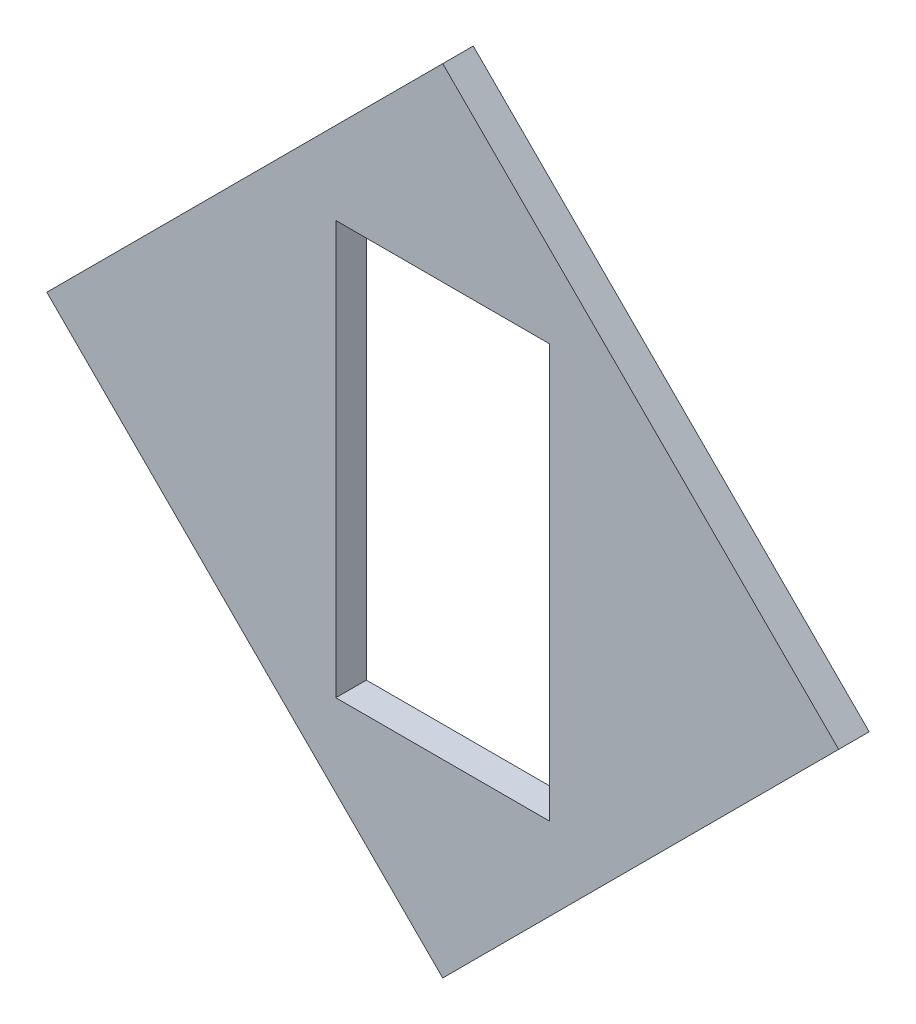
ISO-10303-21;
HEADER;
FILE_DESCRIPTION(('STEP AP214'),'2;1');
FILE_NAME('part.step','',(''),(''),'','','');
FILE_SCHEMA(('AUTOMOTIVE_DESIGN { 1 0 10303 214 1 1 1 1 }'));
ENDSEC;
DATA;
#1=APPLICATION_CONTEXT('core data for automotive mechanical design processes');
#2=APPLICATION_PROTOCOL_DEFINITION('international standard','automotive_design',2000,#1);
#3=PRODUCT_CONTEXT('',#1,'mechanical');
#4=PRODUCT('Part','Part','',(#3));
#5=PRODUCT_RELATED_PRODUCT_CATEGORY('part','',(#4));
#6=PRODUCT_DEFINITION_FORMATION('','',#4);
#7=PRODUCT_DEFINITION_CONTEXT('part definition',#1,'design');
#8=PRODUCT_DEFINITION('design','',#6,#7);
#9=PRODUCT_DEFINITION_SHAPE('','',#8);
#10=(LENGTH_UNIT() NAMED_UNIT(*) SI_UNIT(.MILLI.,.METRE.));
#11=(NAMED_UNIT(*) PLANE_ANGLE_UNIT() SI_UNIT($,.RADIAN.));
#12=(NAMED_UNIT(*) SI_UNIT($,.STERADIAN.) SOLID_ANGLE_UNIT());
#13=UNCERTAINTY_MEASURE_WITH_UNIT(LENGTH_MEASURE(1.E-05),#10,'distance_accuracy_value','');
#14=(GEOMETRIC_REPRESENTATION_CONTEXT(3) GLOBAL_UNCERTAINTY_ASSIGNED_CONTEXT((#13)) GLOBAL_UNIT_ASSIGNED_CONTEXT((#10,
#11,#12)) REPRESENTATION_CONTEXT('',''));
#15=CARTESIAN_POINT('',(0.,0.,0.));
#16=DIRECTION('',(0.,0.,1.));
#17=DIRECTION('',(1.,0.,0.));
#18=AXIS2_PLACEMENT_3D('',#15,#16,#17);
#19=CARTESIAN_POINT('',(0.,38.8908729652601,3.));
#20=DIRECTION('',(-0.707106781186548,-0.707106781186547,0.));
#21=DIRECTION('',(0.707106781186547,-0.707106781186548,0.));
#22=AXIS2_PLACEMENT_3D('',#19,#20,#21);
#23=PLANE('',#22);
#24=DIRECTION('',(-0.707106781186547,0.707106781186548,0.));
#25=VECTOR('',#24,1.);
#26=CARTESIAN_POINT('',(0.,38.8908729652601,0.));
#27=LINE('',#26,#25);
#28=CARTESIAN_POINT('',(38.8908729652601,0.,0.));
#29=VERTEX_POINT('',#28);
#30=CARTESIAN_POINT('',(0.,38.8908729652601,0.));
#31=VERTEX_POINT('',#30);
#32=EDGE_CURVE('E130',#29,#31,#27,.T.);
#33=ORIENTED_EDGE('',*,*,#32,.T.);
#34=DIRECTION('',(0.,0.,-1.));
#35=VECTOR('',#34,1.);
#36=CARTESIAN_POINT('',(0.,38.8908729652601,3.));
#37=LINE('',#36,#35);
#38=CARTESIAN_POINT('',(0.,38.8908729652601,3.));
#39=VERTEX_POINT('',#38);
#40=EDGE_CURVE('E11',#39,#31,#37,.T.);
#41=ORIENTED_EDGE('',*,*,#40,.F.);
#42=DIRECTION('',(-0.707106781186547,0.707106781186548,0.));
#43=VECTOR('',#42,1.);
#44=CARTESIAN_POINT('',(0.,38.8908729652601,3.));
#45=LINE('',#44,#43);
#46=CARTESIAN_POINT('',(38.8908729652601,0.,3.));
#47=VERTEX_POINT('',#46);
#48=EDGE_CURVE('E134',#47,#39,#45,.T.);
#49=ORIENTED_EDGE('',*,*,#48,.F.);
#50=DIRECTION('',(0.,0.,-1.));
#51=VECTOR('',#50,1.);
#52=CARTESIAN_POINT('',(38.8908729652601,0.,3.));
#53=LINE('',#52,#51);
#54=EDGE_CURVE('E144',#47,#29,#53,.T.);
#55=ORIENTED_EDGE('',*,*,#54,.T.);
#56=EDGE_LOOP('',(#33,#41,#49,#55));
#57=FACE_BOUND('',#56,.T.);
#58=ADVANCED_FACE('F33',(#57),#23,.F.);
#59=CARTESIAN_POINT('',(-38.8908729652601,0.,3.));
#60=DIRECTION('',(0.707106781186548,-0.707106781186548,0.));
#61=DIRECTION('',(0.707106781186548,0.707106781186548,0.));
#62=AXIS2_PLACEMENT_3D('',#59,#60,#61);
#63=PLANE('',#62);
#64=DIRECTION('',(-0.707106781186547,-0.707106781186547,0.));
#65=VECTOR('',#64,1.);
#66=CARTESIAN_POINT('',(-38.8908729652601,0.,0.));
#67=LINE('',#66,#65);
#68=CARTESIAN_POINT('',(-38.8908729652601,0.,0.));
#69=VERTEX_POINT('',#68);
#70=EDGE_CURVE('E147',#31,#69,#67,.T.);
#71=ORIENTED_EDGE('',*,*,#70,.T.);
#72=DIRECTION('',(0.,0.,-1.));
#73=VECTOR('',#72,1.);
#74=CARTESIAN_POINT('',(-38.8908729652601,0.,3.));
#75=LINE('',#74,#73);
#76=CARTESIAN_POINT('',(-38.8908729652601,0.,3.));
#77=VERTEX_POINT('',#76);
#78=EDGE_CURVE('E40',#77,#69,#75,.T.);
#79=ORIENTED_EDGE('',*,*,#78,.F.);
#80=DIRECTION('',(-0.707106781186547,-0.707106781186547,0.));
#81=VECTOR('',#80,1.);
#82=CARTESIAN_POINT('',(-38.8908729652601,0.,3.));
#83=LINE('',#82,#81);
#84=EDGE_CURVE('E137',#39,#77,#83,.T.);
#85=ORIENTED_EDGE('',*,*,#84,.F.);
#86=ORIENTED_EDGE('',*,*,#40,.T.);
#87=EDGE_LOOP('',(#71,#79,#85,#86));
#88=FACE_BOUND('',#87,.T.);
#89=ADVANCED_FACE('F175',(#88),#63,.F.);
#90=CARTESIAN_POINT('',(-38.8908729652601,0.,3.));
#91=DIRECTION('',(0.707106781186548,0.707106781186547,0.));
#92=DIRECTION('',(-0.707106781186547,0.707106781186548,0.));
#93=AXIS2_PLACEMENT_3D('',#90,#91,#92);
#94=PLANE('',#93);
#95=DIRECTION('',(0.707106781186547,-0.707106781186548,0.));
#96=VECTOR('',#95,1.);
#97=CARTESIAN_POINT('',(-38.8908729652601,0.,0.));
#98=LINE('',#97,#96);
#99=CARTESIAN_POINT('',(0.,-38.8908729652601,0.));
#100=VERTEX_POINT('',#99);
#101=EDGE_CURVE('E149',#69,#100,#98,.T.);
#102=ORIENTED_EDGE('',*,*,#101,.T.);
#103=DIRECTION('',(0.,0.,-1.));
#104=VECTOR('',#103,1.);
#105=CARTESIAN_POINT('',(0.,-38.8908729652601,3.));
#106=LINE('',#105,#104);
#107=CARTESIAN_POINT('',(0.,-38.8908729652601,3.));
#108=VERTEX_POINT('',#107);
#109=EDGE_CURVE('E154',#108,#100,#106,.T.);
#110=ORIENTED_EDGE('',*,*,#109,.F.);
#111=DIRECTION('',(0.707106781186547,-0.707106781186548,0.));
#112=VECTOR('',#111,1.);
#113=CARTESIAN_POINT('',(-38.8908729652601,0.,3.));
#114=LINE('',#113,#112);
#115=EDGE_CURVE('E140',#77,#108,#114,.T.);
#116=ORIENTED_EDGE('',*,*,#115,.F.);
#117=ORIENTED_EDGE('',*,*,#78,.T.);
#118=EDGE_LOOP('',(#102,#110,#116,#117));
#119=FACE_BOUND('',#118,.T.);
#120=ADVANCED_FACE('F161',(#119),#94,.F.);
#121=CARTESIAN_POINT('',(0.,-38.8908729652601,3.));
#122=DIRECTION('',(-0.707106781186547,0.707106781186548,0.));
#123=DIRECTION('',(-0.707106781186548,-0.707106781186547,0.));
#124=AXIS2_PLACEMENT_3D('',#121,#122,#123);
#125=PLANE('',#124);
#126=DIRECTION('',(0.707106781186548,0.707106781186547,0.));
#127=VECTOR('',#126,1.);
#128=CARTESIAN_POINT('',(0.,-38.8908729652601,0.));
#129=LINE('',#128,#127);
#130=EDGE_CURVE('E138',#100,#29,#129,.T.);
#131=ORIENTED_EDGE('',*,*,#130,.T.);
#132=ORIENTED_EDGE('',*,*,#54,.F.);
#133=DIRECTION('',(0.707106781186548,0.707106781186547,0.));
#134=VECTOR('',#133,1.);
#135=CARTESIAN_POINT('',(0.,-38.8908729652601,3.));
#136=LINE('',#135,#134);
#137=EDGE_CURVE('E142',#108,#47,#136,.T.);
#138=ORIENTED_EDGE('',*,*,#137,.F.);
#139=ORIENTED_EDGE('',*,*,#109,.T.);
#140=EDGE_LOOP('',(#131,#132,#138,#139));
#141=FACE_BOUND('',#140,.T.);
#142=ADVANCED_FACE('F168',(#141),#125,.F.);
#143=CARTESIAN_POINT('',(0.,0.,3.));
#144=DIRECTION('',(0.,0.,1.));
#145=DIRECTION('',(1.,0.,0.));
#146=AXIS2_PLACEMENT_3D('',#143,#144,#145);
#147=PLANE('',#146);
#148=DIRECTION('',(0.,-1.,0.));
#149=VECTOR('',#148,1.);
#150=CARTESIAN_POINT('',(-10.5,-20.3,3.));
#151=LINE('',#150,#149);
#152=CARTESIAN_POINT('',(-10.5,20.3,3.));
#153=VERTEX_POINT('',#152);
#154=CARTESIAN_POINT('',(-10.5,-20.3,3.));
#155=VERTEX_POINT('',#154);
#156=EDGE_CURVE('E47',#153,#155,#151,.T.);
#157=ORIENTED_EDGE('',*,*,#156,.F.);
#158=DIRECTION('',(-1.,0.,0.));
#159=VECTOR('',#158,1.);
#160=CARTESIAN_POINT('',(10.5,20.3,3.));
#161=LINE('',#160,#159);
#162=CARTESIAN_POINT('',(10.5,20.3,3.));
#163=VERTEX_POINT('',#162);
#164=EDGE_CURVE('E115',#163,#153,#161,.T.);
#165=ORIENTED_EDGE('',*,*,#164,.F.);
#166=DIRECTION('',(0.,1.,0.));
#167=VECTOR('',#166,1.);
#168=CARTESIAN_POINT('',(10.5,-20.3,3.));
#169=LINE('',#168,#167);
#170=CARTESIAN_POINT('',(10.5,-20.3,3.));
#171=VERTEX_POINT('',#170);
#172=EDGE_CURVE('E118',#171,#163,#169,.T.);
#173=ORIENTED_EDGE('',*,*,#172,.F.);
#174=DIRECTION('',(1.,0.,0.));
#175=VECTOR('',#174,1.);
#176=CARTESIAN_POINT('',(10.5,-20.3,3.));
#177=LINE('',#176,#175);
#178=EDGE_CURVE('E124',#155,#171,#177,.T.);
#179=ORIENTED_EDGE('',*,*,#178,.F.);
#180=EDGE_LOOP('',(#157,#165,#173,#179));
#181=FACE_BOUND('',#180,.T.);
#182=ORIENTED_EDGE('',*,*,#48,.T.);
#183=ORIENTED_EDGE('',*,*,#84,.T.);
#184=ORIENTED_EDGE('',*,*,#115,.T.);
#185=ORIENTED_EDGE('',*,*,#137,.T.);
#186=EDGE_LOOP('',(#182,#183,#184,#185));
#187=FACE_BOUND('',#186,.T.);
#188=ADVANCED_FACE('F174',(#181,#187),#147,.T.);
#189=CARTESIAN_POINT('',(0.,0.,0.));
#190=DIRECTION('',(0.,0.,1.));
#191=DIRECTION('',(1.,0.,0.));
#192=AXIS2_PLACEMENT_3D('',#189,#190,#191);
#193=PLANE('',#192);
#194=DIRECTION('',(-1.,0.,0.));
#195=VECTOR('',#194,1.);
#196=CARTESIAN_POINT('',(10.5,20.3,0.));
#197=LINE('',#196,#195);
#198=CARTESIAN_POINT('',(10.5,20.3,0.));
#199=VERTEX_POINT('',#198);
#200=CARTESIAN_POINT('',(-10.5,20.3,0.));
#201=VERTEX_POINT('',#200);
#202=EDGE_CURVE('E105',#199,#201,#197,.T.);
#203=ORIENTED_EDGE('',*,*,#202,.T.);
#204=DIRECTION('',(0.,-1.,0.));
#205=VECTOR('',#204,1.);
#206=CARTESIAN_POINT('',(-10.5,-20.3,0.));
#207=LINE('',#206,#205);
#208=CARTESIAN_POINT('',(-10.5,-20.3,0.));
#209=VERTEX_POINT('',#208);
#210=EDGE_CURVE('E99',#201,#209,#207,.T.);
#211=ORIENTED_EDGE('',*,*,#210,.T.);
#212=DIRECTION('',(1.,0.,0.));
#213=VECTOR('',#212,1.);
#214=CARTESIAN_POINT('',(10.5,-20.3,0.));
#215=LINE('',#214,#213);
#216=CARTESIAN_POINT('',(10.5,-20.3,0.));
#217=VERTEX_POINT('',#216);
#218=EDGE_CURVE('E108',#209,#217,#215,.T.);
#219=ORIENTED_EDGE('',*,*,#218,.T.);
#220=DIRECTION('',(0.,1.,0.));
#221=VECTOR('',#220,1.);
#222=CARTESIAN_POINT('',(10.5,-20.3,0.));
#223=LINE('',#222,#221);
#224=EDGE_CURVE('E55',#217,#199,#223,.T.);
#225=ORIENTED_EDGE('',*,*,#224,.T.);
#226=EDGE_LOOP('',(#203,#211,#219,#225));
#227=FACE_BOUND('',#226,.T.);
#228=ORIENTED_EDGE('',*,*,#32,.F.);
#229=ORIENTED_EDGE('',*,*,#130,.F.);
#230=ORIENTED_EDGE('',*,*,#101,.F.);
#231=ORIENTED_EDGE('',*,*,#70,.F.);
#232=EDGE_LOOP('',(#228,#229,#230,#231));
#233=FACE_BOUND('',#232,.T.);
#234=ADVANCED_FACE('F112',(#227,#233),#193,.F.);
#235=CARTESIAN_POINT('',(-10.5,-20.3,0.));
#236=DIRECTION('',(-1.,0.,0.));
#237=DIRECTION('',(0.,0.,1.));
#238=AXIS2_PLACEMENT_3D('',#235,#236,#237);
#239=PLANE('',#238);
#240=ORIENTED_EDGE('',*,*,#156,.T.);
#241=DIRECTION('',(0.,0.,1.));
#242=VECTOR('',#241,1.);
#243=CARTESIAN_POINT('',(-10.5,-20.3,0.));
#244=LINE('',#243,#242);
#245=EDGE_CURVE('E95',#209,#155,#244,.T.);
#246=ORIENTED_EDGE('',*,*,#245,.F.);
#247=ORIENTED_EDGE('',*,*,#210,.F.);
#248=DIRECTION('',(0.,0.,1.));
#249=VECTOR('',#248,1.);
#250=CARTESIAN_POINT('',(-10.5,20.3,0.));
#251=LINE('',#250,#249);
#252=EDGE_CURVE('E128',#201,#153,#251,.T.);
#253=ORIENTED_EDGE('',*,*,#252,.T.);
#254=EDGE_LOOP('',(#240,#246,#247,#253));
#255=FACE_BOUND('',#254,.T.);
#256=ADVANCED_FACE('F97',(#255),#239,.F.);
#257=CARTESIAN_POINT('',(10.5,20.3,0.));
#258=DIRECTION('',(0.,1.,0.));
#259=DIRECTION('',(0.,0.,1.));
#260=AXIS2_PLACEMENT_3D('',#257,#258,#259);
#261=PLANE('',#260);
#262=ORIENTED_EDGE('',*,*,#164,.T.);
#263=ORIENTED_EDGE('',*,*,#252,.F.);
#264=ORIENTED_EDGE('',*,*,#202,.F.);
#265=DIRECTION('',(0.,0.,1.));
#266=VECTOR('',#265,1.);
#267=CARTESIAN_POINT('',(10.5,20.3,0.));
#268=LINE('',#267,#266);
#269=EDGE_CURVE('E131',#199,#163,#268,.T.);
#270=ORIENTED_EDGE('',*,*,#269,.T.);
#271=EDGE_LOOP('',(#262,#263,#264,#270));
#272=FACE_BOUND('',#271,.T.);
#273=ADVANCED_FACE('F192',(#272),#261,.F.);
#274=CARTESIAN_POINT('',(10.5,-20.3,0.));
#275=DIRECTION('',(1.,0.,0.));
#276=DIRECTION('',(0.,0.,-1.));
#277=AXIS2_PLACEMENT_3D('',#274,#275,#276);
#278=PLANE('',#277);
#279=ORIENTED_EDGE('',*,*,#172,.T.);
#280=ORIENTED_EDGE('',*,*,#269,.F.);
#281=ORIENTED_EDGE('',*,*,#224,.F.);
#282=DIRECTION('',(0.,0.,1.));
#283=VECTOR('',#282,1.);
#284=CARTESIAN_POINT('',(10.5,-20.3,0.));
#285=LINE('',#284,#283);
#286=EDGE_CURVE('E104',#217,#171,#285,.T.);
#287=ORIENTED_EDGE('',*,*,#286,.T.);
#288=EDGE_LOOP('',(#279,#280,#281,#287));
#289=FACE_BOUND('',#288,.T.);
#290=ADVANCED_FACE('F195',(#289),#278,.F.);
#291=CARTESIAN_POINT('',(10.5,-20.3,0.));
#292=DIRECTION('',(0.,-1.,0.));
#293=DIRECTION('',(1.,0.,0.));
#294=AXIS2_PLACEMENT_3D('',#291,#292,#293);
#295=PLANE('',#294);
#296=ORIENTED_EDGE('',*,*,#178,.T.);
#297=ORIENTED_EDGE('',*,*,#286,.F.);
#298=ORIENTED_EDGE('',*,*,#218,.F.);
#299=ORIENTED_EDGE('',*,*,#245,.T.);
#300=EDGE_LOOP('',(#296,#297,#298,#299));
#301=FACE_BOUND('',#300,.T.);
#302=ADVANCED_FACE('F109',(#301),#295,.F.);
#303=CLOSED_SHELL('',(#58,#89,#120,#142,#188,#234,#256,#273,#290,#302));
#304=MANIFOLD_SOLID_BREP('B2',#303);
#305=ADVANCED_BREP_SHAPE_REPRESENTATION('',(#18,#304),#14);
#306=SHAPE_DEFINITION_REPRESENTATION(#9,#305);
ENDSEC;
END-ISO-10303-21;
